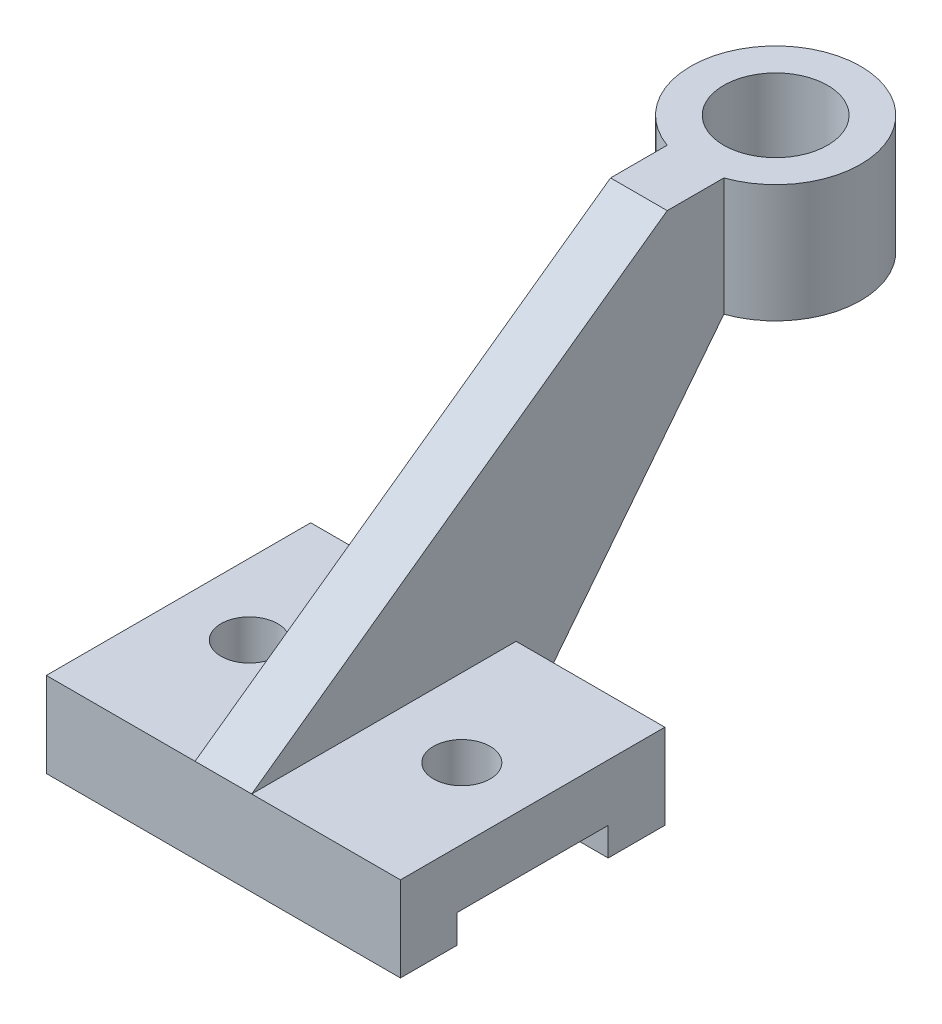
ISO-10303-21;
HEADER;
FILE_DESCRIPTION(('STEP AP214'),'2;1');
FILE_NAME('part.step','',(''),(''),'','','');
FILE_SCHEMA(('AUTOMOTIVE_DESIGN { 1 0 10303 214 1 1 1 1 }'));
ENDSEC;
DATA;
#1=APPLICATION_CONTEXT('core data for automotive mechanical design processes');
#2=APPLICATION_PROTOCOL_DEFINITION('international standard','automotive_design',2000,#1);
#3=PRODUCT_CONTEXT('',#1,'mechanical');
#4=PRODUCT('Part','Part','',(#3));
#5=PRODUCT_RELATED_PRODUCT_CATEGORY('part','',(#4));
#6=PRODUCT_DEFINITION_FORMATION('','',#4);
#7=PRODUCT_DEFINITION_CONTEXT('part definition',#1,'design');
#8=PRODUCT_DEFINITION('design','',#6,#7);
#9=PRODUCT_DEFINITION_SHAPE('','',#8);
#10=(LENGTH_UNIT() NAMED_UNIT(*) SI_UNIT(.MILLI.,.METRE.));
#11=(NAMED_UNIT(*) PLANE_ANGLE_UNIT() SI_UNIT($,.RADIAN.));
#12=(NAMED_UNIT(*) SI_UNIT($,.STERADIAN.) SOLID_ANGLE_UNIT());
#13=UNCERTAINTY_MEASURE_WITH_UNIT(LENGTH_MEASURE(1.E-05),#10,'distance_accuracy_value','');
#14=(GEOMETRIC_REPRESENTATION_CONTEXT(3) GLOBAL_UNCERTAINTY_ASSIGNED_CONTEXT((#13)) GLOBAL_UNIT_ASSIGNED_CONTEXT((#10,
#11,#12)) REPRESENTATION_CONTEXT('',''));
#15=CARTESIAN_POINT('',(0.,0.,0.));
#16=DIRECTION('',(0.,0.,1.));
#17=DIRECTION('',(1.,0.,0.));
#18=AXIS2_PLACEMENT_3D('',#15,#16,#17);
#19=CARTESIAN_POINT('',(-37.5,18.,22.4905660377358));
#20=DIRECTION('',(0.,1.,0.));
#21=DIRECTION('',(0.,0.,1.));
#22=AXIS2_PLACEMENT_3D('',#19,#20,#21);
#23=PLANE('',#22);
#24=CARTESIAN_POINT('',(-22.5,18.,-5.50943396226416));
#25=DIRECTION('',(0.,1.,0.));
#26=DIRECTION('',(0.,0.,1.));
#27=AXIS2_PLACEMENT_3D('',#24,#25,#26);
#28=CIRCLE('',#27,6.);
#29=CARTESIAN_POINT('',(-22.5,18.,0.490566037735844));
#30=VERTEX_POINT('',#29);
#31=EDGE_CURVE('E220',#30,#30,#28,.T.);
#32=ORIENTED_EDGE('',*,*,#31,.F.);
#33=EDGE_LOOP('',(#32));
#34=FACE_BOUND('',#33,.T.);
#35=DIRECTION('',(1.,0.,0.));
#36=VECTOR('',#35,1.);
#37=CARTESIAN_POINT('',(-37.5,18.,22.4905660377358));
#38=LINE('',#37,#36);
#39=CARTESIAN_POINT('',(-37.5,18.,22.4905660377358));
#40=VERTEX_POINT('',#39);
#41=CARTESIAN_POINT('',(-6.,18.,22.4905660377358));
#42=VERTEX_POINT('',#41);
#43=EDGE_CURVE('E46',#40,#42,#38,.T.);
#44=ORIENTED_EDGE('',*,*,#43,.T.);
#45=DIRECTION('',(0.,0.,1.));
#46=VECTOR('',#45,1.);
#47=CARTESIAN_POINT('',(-6.,18.,0.));
#48=LINE('',#47,#46);
#49=CARTESIAN_POINT('',(-6.,18.,-33.5094339622641));
#50=VERTEX_POINT('',#49);
#51=EDGE_CURVE('E181',#50,#42,#48,.T.);
#52=ORIENTED_EDGE('',*,*,#51,.F.);
#53=DIRECTION('',(1.,0.,0.));
#54=VECTOR('',#53,1.);
#55=CARTESIAN_POINT('',(-37.5,18.,-33.5094339622641));
#56=LINE('',#55,#54);
#57=CARTESIAN_POINT('',(-37.5,18.,-33.5094339622641));
#58=VERTEX_POINT('',#57);
#59=EDGE_CURVE('E256',#58,#50,#56,.T.);
#60=ORIENTED_EDGE('',*,*,#59,.F.);
#61=DIRECTION('',(0.,0.,1.));
#62=VECTOR('',#61,1.);
#63=CARTESIAN_POINT('',(-37.5,18.,22.4905660377358));
#64=LINE('',#63,#62);
#65=EDGE_CURVE('E234',#58,#40,#64,.T.);
#66=ORIENTED_EDGE('',*,*,#65,.T.);
#67=EDGE_LOOP('',(#44,#52,#60,#66));
#68=FACE_BOUND('',#67,.T.);
#69=ADVANCED_FACE('F37',(#34,#68),#23,.T.);
#70=CARTESIAN_POINT('',(-37.5,18.,-33.5094339622641));
#71=DIRECTION('',(0.,0.,-1.));
#72=DIRECTION('',(-1.,0.,0.));
#73=AXIS2_PLACEMENT_3D('',#70,#71,#72);
#74=PLANE('',#73);
#75=ORIENTED_EDGE('',*,*,#59,.T.);
#76=DIRECTION('',(0.,1.,0.));
#77=VECTOR('',#76,1.);
#78=CARTESIAN_POINT('',(-6.,0.,-33.5094339622641));
#79=LINE('',#78,#77);
#80=CARTESIAN_POINT('',(-6.,0.,-33.5094339622641));
#81=VERTEX_POINT('',#80);
#82=EDGE_CURVE('E184',#81,#50,#79,.T.);
#83=ORIENTED_EDGE('',*,*,#82,.F.);
#84=DIRECTION('',(1.,0.,0.));
#85=VECTOR('',#84,1.);
#86=CARTESIAN_POINT('',(-37.5,0.,-33.5094339622641));
#87=LINE('',#86,#85);
#88=CARTESIAN_POINT('',(-37.5,0.,-33.5094339622641));
#89=VERTEX_POINT('',#88);
#90=EDGE_CURVE('E259',#89,#81,#87,.T.);
#91=ORIENTED_EDGE('',*,*,#90,.F.);
#92=DIRECTION('',(0.,1.,0.));
#93=VECTOR('',#92,1.);
#94=CARTESIAN_POINT('',(-37.5,18.,-33.5094339622641));
#95=LINE('',#94,#93);
#96=EDGE_CURVE('E230',#89,#58,#95,.T.);
#97=ORIENTED_EDGE('',*,*,#96,.T.);
#98=EDGE_LOOP('',(#75,#83,#91,#97));
#99=FACE_BOUND('',#98,.T.);
#100=ADVANCED_FACE('F310',(#99),#74,.T.);
#101=CARTESIAN_POINT('',(-37.5,0.,-33.5094339622641));
#102=DIRECTION('',(0.,-1.,0.));
#103=DIRECTION('',(0.,0.,-1.));
#104=AXIS2_PLACEMENT_3D('',#101,#102,#103);
#105=PLANE('',#104);
#106=DIRECTION('',(1.,0.,0.));
#107=VECTOR('',#106,1.);
#108=CARTESIAN_POINT('',(-37.5,0.,10.4905660377358));
#109=LINE('',#108,#107);
#110=CARTESIAN_POINT('',(-37.5,0.,10.4905660377358));
#111=VERTEX_POINT('',#110);
#112=CARTESIAN_POINT('',(37.5,0.,10.4905660377358));
#113=VERTEX_POINT('',#112);
#114=EDGE_CURVE('E209',#111,#113,#109,.T.);
#115=ORIENTED_EDGE('',*,*,#114,.T.);
#116=DIRECTION('',(0.,0.,-1.));
#117=VECTOR('',#116,1.);
#118=CARTESIAN_POINT('',(37.5,0.,-33.5094339622641));
#119=LINE('',#118,#117);
#120=CARTESIAN_POINT('',(37.5,0.,22.4905660377359));
#121=VERTEX_POINT('',#120);
#122=EDGE_CURVE('E241',#121,#113,#119,.T.);
#123=ORIENTED_EDGE('',*,*,#122,.F.);
#124=DIRECTION('',(1.,0.,0.));
#125=VECTOR('',#124,1.);
#126=CARTESIAN_POINT('',(-37.5,0.,22.4905660377359));
#127=LINE('',#126,#125);
#128=CARTESIAN_POINT('',(-37.5,0.,22.4905660377359));
#129=VERTEX_POINT('',#128);
#130=EDGE_CURVE('E11',#129,#121,#127,.T.);
#131=ORIENTED_EDGE('',*,*,#130,.F.);
#132=DIRECTION('',(0.,0.,-1.));
#133=VECTOR('',#132,1.);
#134=CARTESIAN_POINT('',(-37.5,0.,-33.5094339622641));
#135=LINE('',#134,#133);
#136=EDGE_CURVE('E227',#129,#111,#135,.T.);
#137=ORIENTED_EDGE('',*,*,#136,.T.);
#138=EDGE_LOOP('',(#115,#123,#131,#137));
#139=FACE_BOUND('',#138,.T.);
#140=ADVANCED_FACE('F288',(#139),#105,.T.);
#141=DIRECTION('',(1.,0.,0.));
#142=VECTOR('',#141,1.);
#143=CARTESIAN_POINT('',(-37.5,0.,-21.5094339622641));
#144=LINE('',#143,#142);
#145=CARTESIAN_POINT('',(-37.5,0.,-21.5094339622641));
#146=VERTEX_POINT('',#145);
#147=CARTESIAN_POINT('',(37.5,0.,-21.5094339622641));
#148=VERTEX_POINT('',#147);
#149=EDGE_CURVE('E62',#146,#148,#144,.T.);
#150=ORIENTED_EDGE('',*,*,#149,.F.);
#151=EDGE_CURVE('E231',#146,#89,#135,.T.);
#152=ORIENTED_EDGE('',*,*,#151,.T.);
#153=ORIENTED_EDGE('',*,*,#90,.T.);
#154=DIRECTION('',(-1.,0.,0.));
#155=VECTOR('',#154,1.);
#156=CARTESIAN_POINT('',(6.,0.,-33.5094339622642));
#157=LINE('',#156,#155);
#158=CARTESIAN_POINT('',(6.,0.,-33.5094339622642));
#159=VERTEX_POINT('',#158);
#160=EDGE_CURVE('E170',#159,#81,#157,.T.);
#161=ORIENTED_EDGE('',*,*,#160,.F.);
#162=CARTESIAN_POINT('',(37.5,0.,-33.5094339622641));
#163=VERTEX_POINT('',#162);
#164=EDGE_CURVE('E240',#159,#163,#87,.T.);
#165=ORIENTED_EDGE('',*,*,#164,.T.);
#166=EDGE_CURVE('E224',#148,#163,#119,.T.);
#167=ORIENTED_EDGE('',*,*,#166,.F.);
#168=EDGE_LOOP('',(#150,#152,#153,#161,#165,#167));
#169=FACE_BOUND('',#168,.T.);
#170=ADVANCED_FACE('F39',(#169),#105,.T.);
#171=CARTESIAN_POINT('',(-37.5,0.,22.4905660377359));
#172=DIRECTION('',(0.,0.,1.));
#173=DIRECTION('',(0.,-1.,0.));
#174=AXIS2_PLACEMENT_3D('',#171,#172,#173);
#175=PLANE('',#174);
#176=DIRECTION('',(0.,-1.,0.));
#177=VECTOR('',#176,1.);
#178=CARTESIAN_POINT('',(37.5,0.,22.4905660377359));
#179=LINE('',#178,#177);
#180=CARTESIAN_POINT('',(37.5,18.,22.4905660377358));
#181=VERTEX_POINT('',#180);
#182=EDGE_CURVE('E250',#181,#121,#179,.T.);
#183=ORIENTED_EDGE('',*,*,#182,.F.);
#184=CARTESIAN_POINT('',(6.,18.,22.4905660377358));
#185=VERTEX_POINT('',#184);
#186=EDGE_CURVE('E255',#185,#181,#38,.T.);
#187=ORIENTED_EDGE('',*,*,#186,.F.);
#188=DIRECTION('',(-1.,0.,0.));
#189=VECTOR('',#188,1.);
#190=CARTESIAN_POINT('',(6.,18.,22.4905660377358));
#191=LINE('',#190,#189);
#192=EDGE_CURVE('E189',#185,#42,#191,.T.);
#193=ORIENTED_EDGE('',*,*,#192,.T.);
#194=ORIENTED_EDGE('',*,*,#43,.F.);
#195=DIRECTION('',(0.,-1.,0.));
#196=VECTOR('',#195,1.);
#197=CARTESIAN_POINT('',(-37.5,0.,22.4905660377359));
#198=LINE('',#197,#196);
#199=EDGE_CURVE('E237',#40,#129,#198,.T.);
#200=ORIENTED_EDGE('',*,*,#199,.T.);
#201=ORIENTED_EDGE('',*,*,#130,.T.);
#202=EDGE_LOOP('',(#183,#187,#193,#194,#200,#201));
#203=FACE_BOUND('',#202,.T.);
#204=ADVANCED_FACE('F283',(#203),#175,.T.);
#205=DIRECTION('',(0.,0.,1.));
#206=VECTOR('',#205,1.);
#207=CARTESIAN_POINT('',(6.,18.,0.));
#208=LINE('',#207,#206);
#209=CARTESIAN_POINT('',(6.,18.,-33.5094339622641));
#210=VERTEX_POINT('',#209);
#211=EDGE_CURVE('E386',#210,#185,#208,.T.);
#212=ORIENTED_EDGE('',*,*,#211,.T.);
#213=ORIENTED_EDGE('',*,*,#186,.T.);
#214=DIRECTION('',(0.,0.,1.));
#215=VECTOR('',#214,1.);
#216=CARTESIAN_POINT('',(37.5,18.,22.4905660377358));
#217=LINE('',#216,#215);
#218=CARTESIAN_POINT('',(37.5,18.,-33.5094339622641));
#219=VERTEX_POINT('',#218);
#220=EDGE_CURVE('E247',#219,#181,#217,.T.);
#221=ORIENTED_EDGE('',*,*,#220,.F.);
#222=EDGE_CURVE('E258',#210,#219,#56,.T.);
#223=ORIENTED_EDGE('',*,*,#222,.F.);
#224=EDGE_LOOP('',(#212,#213,#221,#223));
#225=FACE_BOUND('',#224,.T.);
#226=CARTESIAN_POINT('',(22.5,18.,-5.50943396226416));
#227=DIRECTION('',(0.,1.,0.));
#228=DIRECTION('',(0.,0.,1.));
#229=AXIS2_PLACEMENT_3D('',#226,#227,#228);
#230=CIRCLE('',#229,6.);
#231=CARTESIAN_POINT('',(22.5,18.,0.490566037735844));
#232=VERTEX_POINT('',#231);
#233=EDGE_CURVE('E221',#232,#232,#230,.T.);
#234=ORIENTED_EDGE('',*,*,#233,.F.);
#235=EDGE_LOOP('',(#234));
#236=FACE_BOUND('',#235,.T.);
#237=ADVANCED_FACE('F278',(#225,#236),#23,.T.);
#238=DIRECTION('',(0.,1.,0.));
#239=VECTOR('',#238,1.);
#240=CARTESIAN_POINT('',(6.,0.,-33.5094339622641));
#241=LINE('',#240,#239);
#242=EDGE_CURVE('E172',#159,#210,#241,.T.);
#243=ORIENTED_EDGE('',*,*,#242,.T.);
#244=ORIENTED_EDGE('',*,*,#222,.T.);
#245=DIRECTION('',(0.,1.,0.));
#246=VECTOR('',#245,1.);
#247=CARTESIAN_POINT('',(37.5,18.,-33.5094339622641));
#248=LINE('',#247,#246);
#249=EDGE_CURVE('E244',#163,#219,#248,.T.);
#250=ORIENTED_EDGE('',*,*,#249,.F.);
#251=ORIENTED_EDGE('',*,*,#164,.F.);
#252=EDGE_LOOP('',(#243,#244,#250,#251));
#253=FACE_BOUND('',#252,.T.);
#254=ADVANCED_FACE('F273',(#253),#74,.T.);
#255=CARTESIAN_POINT('',(-37.5,0.,0.));
#256=DIRECTION('',(-1.,0.,0.));
#257=DIRECTION('',(0.,0.,1.));
#258=AXIS2_PLACEMENT_3D('',#255,#256,#257);
#259=PLANE('',#258);
#260=DIRECTION('',(0.,-1.,0.));
#261=VECTOR('',#260,1.);
#262=CARTESIAN_POINT('',(-37.5,0.,10.4905660377358));
#263=LINE('',#262,#261);
#264=CARTESIAN_POINT('',(-37.5,6.,10.4905660377358));
#265=VERTEX_POINT('',#264);
#266=EDGE_CURVE('E201',#265,#111,#263,.T.);
#267=ORIENTED_EDGE('',*,*,#266,.T.);
#268=ORIENTED_EDGE('',*,*,#136,.F.);
#269=ORIENTED_EDGE('',*,*,#199,.F.);
#270=ORIENTED_EDGE('',*,*,#65,.F.);
#271=ORIENTED_EDGE('',*,*,#96,.F.);
#272=ORIENTED_EDGE('',*,*,#151,.F.);
#273=DIRECTION('',(0.,1.,0.));
#274=VECTOR('',#273,1.);
#275=CARTESIAN_POINT('',(-37.5,6.,-21.5094339622641));
#276=LINE('',#275,#274);
#277=CARTESIAN_POINT('',(-37.5,6.,-21.5094339622641));
#278=VERTEX_POINT('',#277);
#279=EDGE_CURVE('E194',#146,#278,#276,.T.);
#280=ORIENTED_EDGE('',*,*,#279,.T.);
#281=DIRECTION('',(0.,0.,1.));
#282=VECTOR('',#281,1.);
#283=CARTESIAN_POINT('',(-37.5,6.,10.4905660377358));
#284=LINE('',#283,#282);
#285=EDGE_CURVE('E197',#278,#265,#284,.T.);
#286=ORIENTED_EDGE('',*,*,#285,.T.);
#287=EDGE_LOOP('',(#267,#268,#269,#270,#271,#272,#280,#286));
#288=FACE_BOUND('',#287,.T.);
#289=ADVANCED_FACE('F325',(#288),#259,.T.);
#290=CARTESIAN_POINT('',(37.5,0.,0.));
#291=DIRECTION('',(-1.,0.,0.));
#292=DIRECTION('',(0.,0.,1.));
#293=AXIS2_PLACEMENT_3D('',#290,#291,#292);
#294=PLANE('',#293);
#295=ORIENTED_EDGE('',*,*,#122,.T.);
#296=DIRECTION('',(0.,-1.,0.));
#297=VECTOR('',#296,1.);
#298=CARTESIAN_POINT('',(37.5,0.,10.4905660377358));
#299=LINE('',#298,#297);
#300=CARTESIAN_POINT('',(37.5,6.,10.4905660377358));
#301=VERTEX_POINT('',#300);
#302=EDGE_CURVE('E198',#301,#113,#299,.T.);
#303=ORIENTED_EDGE('',*,*,#302,.F.);
#304=DIRECTION('',(0.,0.,1.));
#305=VECTOR('',#304,1.);
#306=CARTESIAN_POINT('',(37.5,6.,10.4905660377358));
#307=LINE('',#306,#305);
#308=CARTESIAN_POINT('',(37.5,6.,-21.5094339622641));
#309=VERTEX_POINT('',#308);
#310=EDGE_CURVE('E205',#309,#301,#307,.T.);
#311=ORIENTED_EDGE('',*,*,#310,.F.);
#312=DIRECTION('',(0.,1.,0.));
#313=VECTOR('',#312,1.);
#314=CARTESIAN_POINT('',(37.5,6.,-21.5094339622641));
#315=LINE('',#314,#313);
#316=EDGE_CURVE('E193',#148,#309,#315,.T.);
#317=ORIENTED_EDGE('',*,*,#316,.F.);
#318=ORIENTED_EDGE('',*,*,#166,.T.);
#319=ORIENTED_EDGE('',*,*,#249,.T.);
#320=ORIENTED_EDGE('',*,*,#220,.T.);
#321=ORIENTED_EDGE('',*,*,#182,.T.);
#322=EDGE_LOOP('',(#295,#303,#311,#317,#318,#319,#320,#321));
#323=FACE_BOUND('',#322,.T.);
#324=ADVANCED_FACE('F271',(#323),#294,.F.);
#325=CARTESIAN_POINT('',(-22.5,-57.,-5.50943396226416));
#326=DIRECTION('',(0.,1.,0.));
#327=DIRECTION('',(0.,0.,1.));
#328=AXIS2_PLACEMENT_3D('',#325,#326,#327);
#329=CYLINDRICAL_SURFACE('',#328,6.);
#330=CARTESIAN_POINT('',(-22.5,6.00000000000001,-5.50943396226416));
#331=DIRECTION('',(0.,1.,0.));
#332=DIRECTION('',(0.,0.,1.));
#333=AXIS2_PLACEMENT_3D('',#330,#331,#332);
#334=CIRCLE('',#333,6.);
#335=CARTESIAN_POINT('',(-22.5,6.00000000000001,0.490566037735844));
#336=VERTEX_POINT('',#335);
#337=EDGE_CURVE('E217',#336,#336,#334,.F.);
#338=ORIENTED_EDGE('',*,*,#337,.T.);
#339=EDGE_LOOP('',(#338));
#340=FACE_BOUND('',#339,.T.);
#341=ORIENTED_EDGE('',*,*,#31,.T.);
#342=EDGE_LOOP('',(#341));
#343=FACE_BOUND('',#342,.T.);
#344=ADVANCED_FACE('F332',(#340,#343),#329,.F.);
#345=CARTESIAN_POINT('',(22.5,-57.,-5.50943396226416));
#346=DIRECTION('',(0.,1.,0.));
#347=DIRECTION('',(0.,0.,1.));
#348=AXIS2_PLACEMENT_3D('',#345,#346,#347);
#349=CYLINDRICAL_SURFACE('',#348,6.);
#350=CARTESIAN_POINT('',(22.5,6.00000000000001,-5.50943396226416));
#351=DIRECTION('',(0.,1.,0.));
#352=DIRECTION('',(0.,0.,1.));
#353=AXIS2_PLACEMENT_3D('',#350,#351,#352);
#354=CIRCLE('',#353,6.);
#355=CARTESIAN_POINT('',(22.5,6.00000000000001,0.490566037735844));
#356=VERTEX_POINT('',#355);
#357=EDGE_CURVE('E41',#356,#356,#354,.F.);
#358=ORIENTED_EDGE('',*,*,#357,.T.);
#359=EDGE_LOOP('',(#358));
#360=FACE_BOUND('',#359,.T.);
#361=ORIENTED_EDGE('',*,*,#233,.T.);
#362=EDGE_LOOP('',(#361));
#363=FACE_BOUND('',#362,.T.);
#364=ADVANCED_FACE('F337',(#360,#363),#349,.F.);
#365=CARTESIAN_POINT('',(-37.5,6.,10.4905660377358));
#366=DIRECTION('',(0.,1.,0.));
#367=DIRECTION('',(0.,0.,1.));
#368=AXIS2_PLACEMENT_3D('',#365,#366,#367);
#369=PLANE('',#368);
#370=ORIENTED_EDGE('',*,*,#357,.F.);
#371=EDGE_LOOP('',(#370));
#372=FACE_BOUND('',#371,.T.);
#373=ORIENTED_EDGE('',*,*,#310,.T.);
#374=DIRECTION('',(1.,0.,0.));
#375=VECTOR('',#374,1.);
#376=CARTESIAN_POINT('',(-37.5,6.,10.4905660377358));
#377=LINE('',#376,#375);
#378=EDGE_CURVE('E212',#265,#301,#377,.T.);
#379=ORIENTED_EDGE('',*,*,#378,.F.);
#380=ORIENTED_EDGE('',*,*,#285,.F.);
#381=DIRECTION('',(1.,0.,0.));
#382=VECTOR('',#381,1.);
#383=CARTESIAN_POINT('',(-37.5,6.,-21.5094339622641));
#384=LINE('',#383,#382);
#385=EDGE_CURVE('E214',#278,#309,#384,.T.);
#386=ORIENTED_EDGE('',*,*,#385,.T.);
#387=EDGE_LOOP('',(#373,#379,#380,#386));
#388=FACE_BOUND('',#387,.T.);
#389=ORIENTED_EDGE('',*,*,#337,.F.);
#390=EDGE_LOOP('',(#389));
#391=FACE_BOUND('',#390,.T.);
#392=ADVANCED_FACE('F295',(#372,#388,#391),#369,.F.);
#393=CARTESIAN_POINT('',(-37.5,0.,10.4905660377358));
#394=DIRECTION('',(0.,0.,1.));
#395=DIRECTION('',(1.,0.,0.));
#396=AXIS2_PLACEMENT_3D('',#393,#394,#395);
#397=PLANE('',#396);
#398=ORIENTED_EDGE('',*,*,#302,.T.);
#399=ORIENTED_EDGE('',*,*,#114,.F.);
#400=ORIENTED_EDGE('',*,*,#266,.F.);
#401=ORIENTED_EDGE('',*,*,#378,.T.);
#402=EDGE_LOOP('',(#398,#399,#400,#401));
#403=FACE_BOUND('',#402,.T.);
#404=ADVANCED_FACE('F291',(#403),#397,.F.);
#405=CARTESIAN_POINT('',(-37.5,6.,-21.5094339622641));
#406=DIRECTION('',(0.,0.,-1.));
#407=DIRECTION('',(0.,1.,0.));
#408=AXIS2_PLACEMENT_3D('',#405,#406,#407);
#409=PLANE('',#408);
#410=ORIENTED_EDGE('',*,*,#316,.T.);
#411=ORIENTED_EDGE('',*,*,#385,.F.);
#412=ORIENTED_EDGE('',*,*,#279,.F.);
#413=ORIENTED_EDGE('',*,*,#149,.T.);
#414=EDGE_LOOP('',(#410,#411,#412,#413));
#415=FACE_BOUND('',#414,.T.);
#416=ADVANCED_FACE('F297',(#415),#409,.F.);
#417=CARTESIAN_POINT('',(6.,81.,0.));
#418=DIRECTION('',(0.,1.,0.));
#419=DIRECTION('',(0.,0.,1.));
#420=AXIS2_PLACEMENT_3D('',#417,#418,#419);
#421=PLANE('',#420);
#422=DIRECTION('',(0.,0.,-1.));
#423=VECTOR('',#422,1.);
#424=CARTESIAN_POINT('',(6.,81.,0.));
#425=LINE('',#424,#423);
#426=CARTESIAN_POINT('',(6.,81.,-65.5094339622641));
#427=VERTEX_POINT('',#426);
#428=CARTESIAN_POINT('',(6.,81.,-77.5094339622641));
#429=VERTEX_POINT('',#428);
#430=EDGE_CURVE('E154',#427,#429,#425,.T.);
#431=ORIENTED_EDGE('',*,*,#430,.T.);
#432=CARTESIAN_POINT('',(0.,81.,-94.4799967107413));
#433=DIRECTION('',(0.,1.,0.));
#434=DIRECTION('',(0.,0.,1.));
#435=AXIS2_PLACEMENT_3D('',#432,#433,#434);
#436=CIRCLE('',#435,18.);
#437=CARTESIAN_POINT('',(-6.,81.,-77.5094339622641));
#438=VERTEX_POINT('',#437);
#439=EDGE_CURVE('E140',#429,#438,#436,.T.);
#440=ORIENTED_EDGE('',*,*,#439,.T.);
#441=DIRECTION('',(0.,0.,-1.));
#442=VECTOR('',#441,1.);
#443=CARTESIAN_POINT('',(-6.,81.,0.));
#444=LINE('',#443,#442);
#445=CARTESIAN_POINT('',(-6.,81.,-65.5094339622641));
#446=VERTEX_POINT('',#445);
#447=EDGE_CURVE('E176',#446,#438,#444,.T.);
#448=ORIENTED_EDGE('',*,*,#447,.F.);
#449=DIRECTION('',(-1.,0.,0.));
#450=VECTOR('',#449,1.);
#451=CARTESIAN_POINT('',(6.,81.,-65.5094339622641));
#452=LINE('',#451,#450);
#453=EDGE_CURVE('E157',#427,#446,#452,.T.);
#454=ORIENTED_EDGE('',*,*,#453,.F.);
#455=EDGE_LOOP('',(#431,#440,#448,#454));
#456=FACE_BOUND('',#455,.T.);
#457=CARTESIAN_POINT('',(0.,81.,-94.4799967107413));
#458=DIRECTION('',(0.,1.,0.));
#459=DIRECTION('',(0.,0.,1.));
#460=AXIS2_PLACEMENT_3D('',#457,#458,#459);
#461=CIRCLE('',#460,11.);
#462=CARTESIAN_POINT('',(0.,81.,-83.4799967107413));
#463=VERTEX_POINT('',#462);
#464=EDGE_CURVE('E380',#463,#463,#461,.T.);
#465=ORIENTED_EDGE('',*,*,#464,.F.);
#466=EDGE_LOOP('',(#465));
#467=FACE_BOUND('',#466,.T.);
#468=ADVANCED_FACE('F155',(#456,#467),#421,.T.);
#469=CARTESIAN_POINT('',(6.,22.5458634093065,16.1407885771172));
#470=DIRECTION('',(0.,0.813108686159209,0.582111900318525));
#471=DIRECTION('',(0.,-0.582111900318525,0.81310868615921));
#472=AXIS2_PLACEMENT_3D('',#469,#470,#471);
#473=PLANE('',#472);
#474=DIRECTION('',(0.,0.582111900318525,-0.81310868615921));
#475=VECTOR('',#474,1.);
#476=CARTESIAN_POINT('',(-6.,22.5458634093065,16.1407885771172));
#477=LINE('',#476,#475);
#478=EDGE_CURVE('E178',#42,#446,#477,.T.);
#479=ORIENTED_EDGE('',*,*,#478,.F.);
#480=ORIENTED_EDGE('',*,*,#192,.F.);
#481=DIRECTION('',(0.,0.582111900318525,-0.81310868615921));
#482=VECTOR('',#481,1.);
#483=CARTESIAN_POINT('',(6.,22.5458634093065,16.1407885771172));
#484=LINE('',#483,#482);
#485=EDGE_CURVE('E161',#185,#427,#484,.T.);
#486=ORIENTED_EDGE('',*,*,#485,.T.);
#487=ORIENTED_EDGE('',*,*,#453,.T.);
#488=EDGE_LOOP('',(#479,#480,#486,#487));
#489=FACE_BOUND('',#488,.T.);
#490=ADVANCED_FACE('F304',(#489),#473,.T.);
#491=CARTESIAN_POINT('',(6.,-16.2790310100589,-20.718766740075));
#492=DIRECTION('',(0.,-0.617821551931903,-0.786318338822423));
#493=DIRECTION('',(0.,0.786318338822423,-0.617821551931903));
#494=AXIS2_PLACEMENT_3D('',#491,#492,#493);
#495=PLANE('',#494);
#496=DIRECTION('',(0.,-0.786318338822423,0.617821551931903));
#497=VECTOR('',#496,1.);
#498=CARTESIAN_POINT('',(-6.,-16.2790310100589,-20.718766740075));
#499=LINE('',#498,#497);
#500=CARTESIAN_POINT('',(-6.,56.,-77.5094339622641));
#501=VERTEX_POINT('',#500);
#502=EDGE_CURVE('E54',#501,#81,#499,.T.);
#503=ORIENTED_EDGE('',*,*,#502,.F.);
#504=DIRECTION('',(-1.,0.,0.));
#505=VECTOR('',#504,1.);
#506=CARTESIAN_POINT('',(6.,56.,-77.5094339622641));
#507=LINE('',#506,#505);
#508=CARTESIAN_POINT('',(6.,56.,-77.5094339622641));
#509=VERTEX_POINT('',#508);
#510=EDGE_CURVE('E167',#509,#501,#507,.T.);
#511=ORIENTED_EDGE('',*,*,#510,.F.);
#512=DIRECTION('',(0.,-0.786318338822423,0.617821551931903));
#513=VECTOR('',#512,1.);
#514=CARTESIAN_POINT('',(6.,-16.2790310100589,-20.718766740075));
#515=LINE('',#514,#513);
#516=EDGE_CURVE('E166',#509,#159,#515,.T.);
#517=ORIENTED_EDGE('',*,*,#516,.T.);
#518=ORIENTED_EDGE('',*,*,#160,.T.);
#519=EDGE_LOOP('',(#503,#511,#517,#518));
#520=FACE_BOUND('',#519,.T.);
#521=ADVANCED_FACE('F354',(#520),#495,.T.);
#522=CARTESIAN_POINT('',(6.,0.,0.));
#523=DIRECTION('',(1.,0.,0.));
#524=DIRECTION('',(0.,0.,-1.));
#525=AXIS2_PLACEMENT_3D('',#522,#523,#524);
#526=PLANE('',#525);
#527=ORIENTED_EDGE('',*,*,#430,.F.);
#528=ORIENTED_EDGE('',*,*,#485,.F.);
#529=ORIENTED_EDGE('',*,*,#211,.F.);
#530=ORIENTED_EDGE('',*,*,#242,.F.);
#531=ORIENTED_EDGE('',*,*,#516,.F.);
#532=DIRECTION('',(0.,-1.,0.));
#533=VECTOR('',#532,1.);
#534=CARTESIAN_POINT('',(6.,0.,-77.5094339622641));
#535=LINE('',#534,#533);
#536=EDGE_CURVE('E144',#429,#509,#535,.T.);
#537=ORIENTED_EDGE('',*,*,#536,.F.);
#538=EDGE_LOOP('',(#527,#528,#529,#530,#531,#537));
#539=FACE_BOUND('',#538,.T.);
#540=ADVANCED_FACE('F164',(#539),#526,.T.);
#541=CARTESIAN_POINT('',(-6.,0.,0.));
#542=DIRECTION('',(1.,0.,0.));
#543=DIRECTION('',(0.,0.,-1.));
#544=AXIS2_PLACEMENT_3D('',#541,#542,#543);
#545=PLANE('',#544);
#546=ORIENTED_EDGE('',*,*,#447,.T.);
#547=DIRECTION('',(0.,-1.,0.));
#548=VECTOR('',#547,1.);
#549=CARTESIAN_POINT('',(-6.,0.,-77.5094339622641));
#550=LINE('',#549,#548);
#551=EDGE_CURVE('E146',#438,#501,#550,.T.);
#552=ORIENTED_EDGE('',*,*,#551,.T.);
#553=ORIENTED_EDGE('',*,*,#502,.T.);
#554=ORIENTED_EDGE('',*,*,#82,.T.);
#555=ORIENTED_EDGE('',*,*,#51,.T.);
#556=ORIENTED_EDGE('',*,*,#478,.T.);
#557=EDGE_LOOP('',(#546,#552,#553,#554,#555,#556));
#558=FACE_BOUND('',#557,.T.);
#559=ADVANCED_FACE('F359',(#558),#545,.F.);
#560=CARTESIAN_POINT('',(0.,56.,-94.4799967107413));
#561=DIRECTION('',(0.,1.,0.));
#562=DIRECTION('',(0.,0.,1.));
#563=AXIS2_PLACEMENT_3D('',#560,#561,#562);
#564=CYLINDRICAL_SURFACE('',#563,18.);
#565=ORIENTED_EDGE('',*,*,#439,.F.);
#566=ORIENTED_EDGE('',*,*,#536,.T.);
#567=CARTESIAN_POINT('',(0.,56.,-94.4799967107413));
#568=DIRECTION('',(0.,1.,0.));
#569=DIRECTION('',(0.,0.,1.));
#570=AXIS2_PLACEMENT_3D('',#567,#568,#569);
#571=CIRCLE('',#570,18.);
#572=EDGE_CURVE('E150',#509,#501,#571,.T.);
#573=ORIENTED_EDGE('',*,*,#572,.T.);
#574=ORIENTED_EDGE('',*,*,#551,.F.);
#575=EDGE_LOOP('',(#565,#566,#573,#574));
#576=FACE_BOUND('',#575,.T.);
#577=ADVANCED_FACE('F142',(#576),#564,.T.);
#578=CARTESIAN_POINT('',(0.,56.,-94.4799967107413));
#579=DIRECTION('',(0.,1.,0.));
#580=DIRECTION('',(0.,0.,1.));
#581=AXIS2_PLACEMENT_3D('',#578,#579,#580);
#582=PLANE('',#581);
#583=ORIENTED_EDGE('',*,*,#510,.T.);
#584=ORIENTED_EDGE('',*,*,#572,.F.);
#585=EDGE_LOOP('',(#583,#584));
#586=FACE_BOUND('',#585,.T.);
#587=CARTESIAN_POINT('',(0.,56.,-94.4799967107413));
#588=DIRECTION('',(0.,1.,0.));
#589=DIRECTION('',(0.,0.,1.));
#590=AXIS2_PLACEMENT_3D('',#587,#588,#589);
#591=CIRCLE('',#590,11.);
#592=CARTESIAN_POINT('',(0.,56.,-83.4799967107413));
#593=VERTEX_POINT('',#592);
#594=EDGE_CURVE('E151',#593,#593,#591,.T.);
#595=ORIENTED_EDGE('',*,*,#594,.T.);
#596=EDGE_LOOP('',(#595));
#597=FACE_BOUND('',#596,.T.);
#598=ADVANCED_FACE('F366',(#586,#597),#582,.F.);
#599=CARTESIAN_POINT('',(0.,56.,-94.4799967107413));
#600=DIRECTION('',(0.,1.,0.));
#601=DIRECTION('',(0.,0.,1.));
#602=AXIS2_PLACEMENT_3D('',#599,#600,#601);
#603=CYLINDRICAL_SURFACE('',#602,11.);
#604=ORIENTED_EDGE('',*,*,#594,.F.);
#605=EDGE_LOOP('',(#604));
#606=FACE_BOUND('',#605,.T.);
#607=ORIENTED_EDGE('',*,*,#464,.T.);
#608=EDGE_LOOP('',(#607));
#609=FACE_BOUND('',#608,.T.);
#610=ADVANCED_FACE('F369',(#606,#609),#603,.F.);
#611=CLOSED_SHELL('',(#69,#100,#140,#170,#204,#237,#254,#289,#324,#344,#364,#392,#404,#416,#468,
#490,#521,#540,#559,#577,#598,#610));
#612=MANIFOLD_SOLID_BREP('B2',#611);
#613=ADVANCED_BREP_SHAPE_REPRESENTATION('',(#18,#612),#14);
#614=SHAPE_DEFINITION_REPRESENTATION(#9,#613);
ENDSEC;
END-ISO-10303-21;
